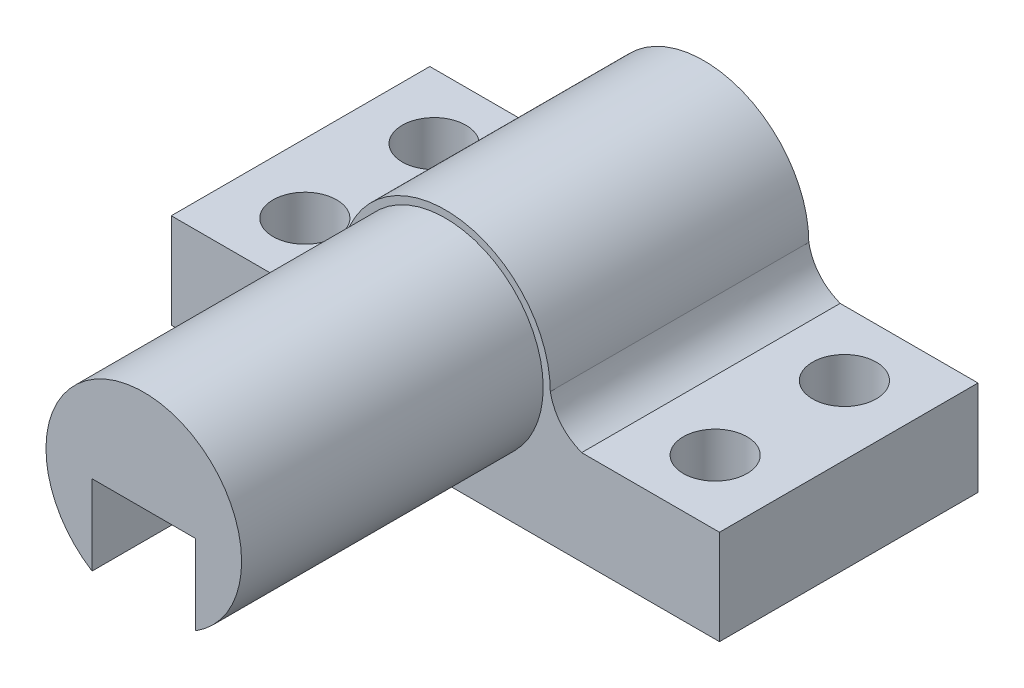
ISO-10303-21;
HEADER;
FILE_DESCRIPTION(('STEP AP214'),'2;1');
FILE_NAME('part.step','',(''),(''),'','','');
FILE_SCHEMA(('AUTOMOTIVE_DESIGN { 1 0 10303 214 1 1 1 1 }'));
ENDSEC;
DATA;
#1=APPLICATION_CONTEXT('core data for automotive mechanical design processes');
#2=APPLICATION_PROTOCOL_DEFINITION('international standard','automotive_design',2000,#1);
#3=PRODUCT_CONTEXT('',#1,'mechanical');
#4=PRODUCT('Part','Part','',(#3));
#5=PRODUCT_RELATED_PRODUCT_CATEGORY('part','',(#4));
#6=PRODUCT_DEFINITION_FORMATION('','',#4);
#7=PRODUCT_DEFINITION_CONTEXT('part definition',#1,'design');
#8=PRODUCT_DEFINITION('design','',#6,#7);
#9=PRODUCT_DEFINITION_SHAPE('','',#8);
#10=(LENGTH_UNIT() NAMED_UNIT(*) SI_UNIT(.MILLI.,.METRE.));
#11=(NAMED_UNIT(*) PLANE_ANGLE_UNIT() SI_UNIT($,.RADIAN.));
#12=(NAMED_UNIT(*) SI_UNIT($,.STERADIAN.) SOLID_ANGLE_UNIT());
#13=UNCERTAINTY_MEASURE_WITH_UNIT(LENGTH_MEASURE(1.E-05),#10,'distance_accuracy_value','');
#14=(GEOMETRIC_REPRESENTATION_CONTEXT(3) GLOBAL_UNCERTAINTY_ASSIGNED_CONTEXT((#13)) GLOBAL_UNIT_ASSIGNED_CONTEXT((#10,
#11,#12)) REPRESENTATION_CONTEXT('',''));
#15=CARTESIAN_POINT('',(0.,0.,0.));
#16=DIRECTION('',(0.,0.,1.));
#17=DIRECTION('',(1.,0.,0.));
#18=AXIS2_PLACEMENT_3D('',#15,#16,#17);
#19=CARTESIAN_POINT('',(15.8085768830098,-4.3236532196309,30.));
#20=CARTESIAN_POINT('',(12.801032903541,-3.08392205228038,30.));
#21=CARTESIAN_POINT('',(12.175,0.,30.));
#22=B_SPLINE_CURVE_WITH_KNOTS('',2,(#19,#20,#21),.UNSPECIFIED.,.F.,.F.,(3,3),(0.,1.),.UNSPECIFIED.);
#23=DIRECTION('',(0.,0.,-1.));
#24=VECTOR('',#23,1.);
#25=SURFACE_OF_LINEAR_EXTRUSION('',#22,#24);
#26=CARTESIAN_POINT('',(15.8085768830098,-4.3236532196309,0.));
#27=CARTESIAN_POINT('',(12.801032903541,-3.08392205228038,0.));
#28=CARTESIAN_POINT('',(12.175,0.,0.));
#29=B_SPLINE_CURVE_WITH_KNOTS('',2,(#26,#27,#28),.UNSPECIFIED.,.F.,.F.,(3,3),(0.,1.),.UNSPECIFIED.);
#30=CARTESIAN_POINT('',(15.8085768830097,-4.3236532196309,0.));
#31=VERTEX_POINT('',#30);
#32=CARTESIAN_POINT('',(12.175,0.,0.));
#33=VERTEX_POINT('',#32);
#34=EDGE_CURVE('E159',#31,#33,#29,.T.);
#35=ORIENTED_EDGE('',*,*,#34,.T.);
#36=DIRECTION('',(0.,0.,-1.));
#37=VECTOR('',#36,1.);
#38=CARTESIAN_POINT('',(12.175,0.,30.));
#39=LINE('',#38,#37);
#40=CARTESIAN_POINT('',(12.175,0.,30.));
#41=VERTEX_POINT('',#40);
#42=EDGE_CURVE('E212',#41,#33,#39,.T.);
#43=ORIENTED_EDGE('',*,*,#42,.F.);
#44=CARTESIAN_POINT('',(15.8085768830097,-4.3236532196309,30.));
#45=VERTEX_POINT('',#44);
#46=EDGE_CURVE('E193',#45,#41,#22,.T.);
#47=ORIENTED_EDGE('',*,*,#46,.F.);
#48=DIRECTION('',(0.,0.,-1.));
#49=VECTOR('',#48,1.);
#50=CARTESIAN_POINT('',(15.8085768830097,-4.3236532196309,30.));
#51=LINE('',#50,#49);
#52=EDGE_CURVE('E155',#45,#31,#51,.T.);
#53=ORIENTED_EDGE('',*,*,#52,.T.);
#54=EDGE_LOOP('',(#35,#43,#47,#53));
#55=FACE_BOUND('',#54,.T.);
#56=ADVANCED_FACE('F45',(#55),#25,.F.);
#57=CARTESIAN_POINT('',(0.,0.,30.));
#58=DIRECTION('',(0.,0.,-1.));
#59=DIRECTION('',(-1.,0.,0.));
#60=AXIS2_PLACEMENT_3D('',#57,#58,#59);
#61=CYLINDRICAL_SURFACE('',#60,12.175);
#62=CARTESIAN_POINT('',(0.,0.,0.));
#63=DIRECTION('',(0.,0.,1.));
#64=DIRECTION('',(1.,0.,0.));
#65=AXIS2_PLACEMENT_3D('',#62,#63,#64);
#66=CIRCLE('',#65,12.175);
#67=CARTESIAN_POINT('',(-12.175,0.,0.));
#68=VERTEX_POINT('',#67);
#69=EDGE_CURVE('E165',#33,#68,#66,.T.);
#70=ORIENTED_EDGE('',*,*,#69,.T.);
#71=DIRECTION('',(0.,0.,-1.));
#72=VECTOR('',#71,1.);
#73=CARTESIAN_POINT('',(-12.175,0.,30.));
#74=LINE('',#73,#72);
#75=CARTESIAN_POINT('',(-12.175,0.,30.));
#76=VERTEX_POINT('',#75);
#77=EDGE_CURVE('E208',#76,#68,#74,.T.);
#78=ORIENTED_EDGE('',*,*,#77,.F.);
#79=CARTESIAN_POINT('',(0.,0.,30.));
#80=DIRECTION('',(0.,0.,1.));
#81=DIRECTION('',(1.,0.,0.));
#82=AXIS2_PLACEMENT_3D('',#79,#80,#81);
#83=CIRCLE('',#82,12.175);
#84=EDGE_CURVE('E112',#41,#76,#83,.T.);
#85=ORIENTED_EDGE('',*,*,#84,.F.);
#86=ORIENTED_EDGE('',*,*,#42,.T.);
#87=EDGE_LOOP('',(#70,#78,#85,#86));
#88=FACE_BOUND('',#87,.T.);
#89=ADVANCED_FACE('F251',(#88),#61,.T.);
#90=CARTESIAN_POINT('',(-12.175,0.,30.));
#91=CARTESIAN_POINT('',(-12.801032903541,-3.08392205228038,30.));
#92=CARTESIAN_POINT('',(-15.8085768830097,-4.3236532196309,30.));
#93=B_SPLINE_CURVE_WITH_KNOTS('',2,(#90,#91,#92),.UNSPECIFIED.,.F.,.F.,(3,3),(0.,1.),.UNSPECIFIED.);
#94=DIRECTION('',(0.,0.,-1.));
#95=VECTOR('',#94,1.);
#96=SURFACE_OF_LINEAR_EXTRUSION('',#93,#95);
#97=CARTESIAN_POINT('',(-12.175,0.,0.));
#98=CARTESIAN_POINT('',(-12.801032903541,-3.08392205228038,0.));
#99=CARTESIAN_POINT('',(-15.8085768830097,-4.3236532196309,0.));
#100=B_SPLINE_CURVE_WITH_KNOTS('',2,(#97,#98,#99),.UNSPECIFIED.,.F.,.F.,(3,3),(0.,1.),.UNSPECIFIED.);
#101=CARTESIAN_POINT('',(-15.8085768830097,-4.3236532196309,0.));
#102=VERTEX_POINT('',#101);
#103=EDGE_CURVE('E172',#68,#102,#100,.T.);
#104=ORIENTED_EDGE('',*,*,#103,.T.);
#105=DIRECTION('',(0.,0.,-1.));
#106=VECTOR('',#105,1.);
#107=CARTESIAN_POINT('',(-15.8085768830097,-4.3236532196309,30.));
#108=LINE('',#107,#106);
#109=CARTESIAN_POINT('',(-15.8085768830097,-4.3236532196309,30.));
#110=VERTEX_POINT('',#109);
#111=EDGE_CURVE('E204',#110,#102,#108,.T.);
#112=ORIENTED_EDGE('',*,*,#111,.F.);
#113=EDGE_CURVE('E236',#76,#110,#93,.T.);
#114=ORIENTED_EDGE('',*,*,#113,.F.);
#115=ORIENTED_EDGE('',*,*,#77,.T.);
#116=EDGE_LOOP('',(#104,#112,#114,#115));
#117=FACE_BOUND('',#116,.T.);
#118=ADVANCED_FACE('F247',(#117),#96,.F.);
#119=CARTESIAN_POINT('',(-31.8085768830098,-4.32365321963091,30.));
#120=DIRECTION('',(0.,-1.,0.));
#121=DIRECTION('',(1.,0.,0.));
#122=AXIS2_PLACEMENT_3D('',#119,#120,#121);
#123=PLANE('',#122);
#124=CARTESIAN_POINT('',(-23.8085768830097,-4.3236532196309,22.5));
#125=DIRECTION('',(0.,1.,0.));
#126=DIRECTION('',(0.,0.,-1.));
#127=AXIS2_PLACEMENT_3D('',#124,#125,#126);
#128=CIRCLE('',#127,3.7);
#129=CARTESIAN_POINT('',(-23.8085768830097,-4.3236532196309,18.8));
#130=VERTEX_POINT('',#129);
#131=EDGE_CURVE('E304',#130,#130,#128,.T.);
#132=ORIENTED_EDGE('',*,*,#131,.F.);
#133=EDGE_LOOP('',(#132));
#134=FACE_BOUND('',#133,.T.);
#135=CARTESIAN_POINT('',(-23.8085768830097,-4.3236532196309,7.5));
#136=DIRECTION('',(0.,1.,0.));
#137=DIRECTION('',(0.,0.,1.));
#138=AXIS2_PLACEMENT_3D('',#135,#136,#137);
#139=CIRCLE('',#138,3.7);
#140=CARTESIAN_POINT('',(-23.8085768830097,-4.3236532196309,11.2));
#141=VERTEX_POINT('',#140);
#142=EDGE_CURVE('E307',#141,#141,#139,.T.);
#143=ORIENTED_EDGE('',*,*,#142,.F.);
#144=EDGE_LOOP('',(#143));
#145=FACE_BOUND('',#144,.T.);
#146=DIRECTION('',(-1.,0.,0.));
#147=VECTOR('',#146,1.);
#148=CARTESIAN_POINT('',(-31.8085768830098,-4.32365321963091,0.));
#149=LINE('',#148,#147);
#150=CARTESIAN_POINT('',(-31.8085768830098,-4.32365321963091,0.));
#151=VERTEX_POINT('',#150);
#152=EDGE_CURVE('E177',#102,#151,#149,.T.);
#153=ORIENTED_EDGE('',*,*,#152,.T.);
#154=DIRECTION('',(0.,0.,-1.));
#155=VECTOR('',#154,1.);
#156=CARTESIAN_POINT('',(-31.8085768830098,-4.32365321963091,30.));
#157=LINE('',#156,#155);
#158=CARTESIAN_POINT('',(-31.8085768830098,-4.32365321963091,30.));
#159=VERTEX_POINT('',#158);
#160=EDGE_CURVE('E200',#159,#151,#157,.T.);
#161=ORIENTED_EDGE('',*,*,#160,.F.);
#162=DIRECTION('',(-1.,0.,0.));
#163=VECTOR('',#162,1.);
#164=CARTESIAN_POINT('',(-31.8085768830098,-4.32365321963091,30.));
#165=LINE('',#164,#163);
#166=EDGE_CURVE('E242',#110,#159,#165,.T.);
#167=ORIENTED_EDGE('',*,*,#166,.F.);
#168=ORIENTED_EDGE('',*,*,#111,.T.);
#169=EDGE_LOOP('',(#153,#161,#167,#168));
#170=FACE_BOUND('',#169,.T.);
#171=ADVANCED_FACE('F250',(#134,#145,#170),#123,.F.);
#172=CARTESIAN_POINT('',(-31.8085768830098,-15.3236532196309,30.));
#173=DIRECTION('',(1.,0.,0.));
#174=DIRECTION('',(0.,0.,-1.));
#175=AXIS2_PLACEMENT_3D('',#172,#173,#174);
#176=PLANE('',#175);
#177=DIRECTION('',(0.,-1.,0.));
#178=VECTOR('',#177,1.);
#179=CARTESIAN_POINT('',(-31.8085768830098,-15.3236532196309,0.));
#180=LINE('',#179,#178);
#181=CARTESIAN_POINT('',(-31.8085768830098,-15.3236532196309,0.));
#182=VERTEX_POINT('',#181);
#183=EDGE_CURVE('E183',#151,#182,#180,.T.);
#184=ORIENTED_EDGE('',*,*,#183,.T.);
#185=DIRECTION('',(0.,0.,-1.));
#186=VECTOR('',#185,1.);
#187=CARTESIAN_POINT('',(-31.8085768830098,-15.3236532196309,30.));
#188=LINE('',#187,#186);
#189=CARTESIAN_POINT('',(-31.8085768830098,-15.3236532196309,30.));
#190=VERTEX_POINT('',#189);
#191=EDGE_CURVE('E148',#190,#182,#188,.T.);
#192=ORIENTED_EDGE('',*,*,#191,.F.);
#193=DIRECTION('',(0.,-1.,0.));
#194=VECTOR('',#193,1.);
#195=CARTESIAN_POINT('',(-31.8085768830098,-15.3236532196309,30.));
#196=LINE('',#195,#194);
#197=EDGE_CURVE('E134',#159,#190,#196,.T.);
#198=ORIENTED_EDGE('',*,*,#197,.F.);
#199=ORIENTED_EDGE('',*,*,#160,.T.);
#200=EDGE_LOOP('',(#184,#192,#198,#199));
#201=FACE_BOUND('',#200,.T.);
#202=ADVANCED_FACE('F272',(#201),#176,.F.);
#203=CARTESIAN_POINT('',(-31.8085768830098,-15.3236532196309,30.));
#204=DIRECTION('',(0.,1.,0.));
#205=DIRECTION('',(-1.,0.,0.));
#206=AXIS2_PLACEMENT_3D('',#203,#204,#205);
#207=PLANE('',#206);
#208=CARTESIAN_POINT('',(23.8085768830097,-15.3236532196309,7.5));
#209=DIRECTION('',(0.,1.,0.));
#210=DIRECTION('',(0.,0.,-1.));
#211=AXIS2_PLACEMENT_3D('',#208,#209,#210);
#212=CIRCLE('',#211,3.7);
#213=CARTESIAN_POINT('',(23.8085768830097,-15.3236532196309,3.8));
#214=VERTEX_POINT('',#213);
#215=EDGE_CURVE('E318',#214,#214,#212,.T.);
#216=ORIENTED_EDGE('',*,*,#215,.T.);
#217=EDGE_LOOP('',(#216));
#218=FACE_BOUND('',#217,.T.);
#219=CARTESIAN_POINT('',(23.8085768830097,-15.3236532196309,22.5));
#220=DIRECTION('',(0.,1.,0.));
#221=DIRECTION('',(0.,0.,1.));
#222=AXIS2_PLACEMENT_3D('',#219,#220,#221);
#223=CIRCLE('',#222,3.7);
#224=CARTESIAN_POINT('',(23.8085768830097,-15.3236532196309,26.2));
#225=VERTEX_POINT('',#224);
#226=EDGE_CURVE('E327',#225,#225,#223,.T.);
#227=ORIENTED_EDGE('',*,*,#226,.T.);
#228=EDGE_LOOP('',(#227));
#229=FACE_BOUND('',#228,.T.);
#230=CARTESIAN_POINT('',(-23.8085768830097,-15.3236532196309,22.5));
#231=DIRECTION('',(0.,1.,0.));
#232=DIRECTION('',(0.,0.,-1.));
#233=AXIS2_PLACEMENT_3D('',#230,#231,#232);
#234=CIRCLE('',#233,3.7);
#235=CARTESIAN_POINT('',(-23.8085768830097,-15.3236532196309,18.8));
#236=VERTEX_POINT('',#235);
#237=EDGE_CURVE('E315',#236,#236,#234,.T.);
#238=ORIENTED_EDGE('',*,*,#237,.T.);
#239=EDGE_LOOP('',(#238));
#240=FACE_BOUND('',#239,.T.);
#241=CARTESIAN_POINT('',(-23.8085768830097,-15.3236532196309,7.5));
#242=DIRECTION('',(0.,1.,0.));
#243=DIRECTION('',(0.,0.,1.));
#244=AXIS2_PLACEMENT_3D('',#241,#242,#243);
#245=CIRCLE('',#244,3.7);
#246=CARTESIAN_POINT('',(-23.8085768830097,-15.3236532196309,11.2));
#247=VERTEX_POINT('',#246);
#248=EDGE_CURVE('E310',#247,#247,#245,.T.);
#249=ORIENTED_EDGE('',*,*,#248,.T.);
#250=EDGE_LOOP('',(#249));
#251=FACE_BOUND('',#250,.T.);
#252=DIRECTION('',(1.,0.,0.));
#253=VECTOR('',#252,1.);
#254=CARTESIAN_POINT('',(-31.8085768830098,-15.3236532196309,0.));
#255=LINE('',#254,#253);
#256=CARTESIAN_POINT('',(31.8085768830098,-15.3236532196309,0.));
#257=VERTEX_POINT('',#256);
#258=EDGE_CURVE('E144',#182,#257,#255,.T.);
#259=ORIENTED_EDGE('',*,*,#258,.T.);
#260=DIRECTION('',(0.,0.,-1.));
#261=VECTOR('',#260,1.);
#262=CARTESIAN_POINT('',(31.8085768830098,-15.3236532196309,30.));
#263=LINE('',#262,#261);
#264=CARTESIAN_POINT('',(31.8085768830098,-15.3236532196309,30.));
#265=VERTEX_POINT('',#264);
#266=EDGE_CURVE('E141',#265,#257,#263,.T.);
#267=ORIENTED_EDGE('',*,*,#266,.F.);
#268=DIRECTION('',(1.,0.,0.));
#269=VECTOR('',#268,1.);
#270=CARTESIAN_POINT('',(-31.8085768830098,-15.3236532196309,30.));
#271=LINE('',#270,#269);
#272=EDGE_CURVE('E127',#190,#265,#271,.T.);
#273=ORIENTED_EDGE('',*,*,#272,.F.);
#274=ORIENTED_EDGE('',*,*,#191,.T.);
#275=EDGE_LOOP('',(#259,#267,#273,#274));
#276=FACE_BOUND('',#275,.T.);
#277=ADVANCED_FACE('F142',(#218,#229,#240,#251,#276),#207,.F.);
#278=CARTESIAN_POINT('',(31.8085768830098,-15.3236532196309,30.));
#279=DIRECTION('',(-1.,0.,0.));
#280=DIRECTION('',(0.,0.,1.));
#281=AXIS2_PLACEMENT_3D('',#278,#279,#280);
#282=PLANE('',#281);
#283=DIRECTION('',(0.,1.,0.));
#284=VECTOR('',#283,1.);
#285=CARTESIAN_POINT('',(31.8085768830098,-15.3236532196309,0.));
#286=LINE('',#285,#284);
#287=CARTESIAN_POINT('',(31.8085768830098,-4.3236532196309,0.));
#288=VERTEX_POINT('',#287);
#289=EDGE_CURVE('E188',#257,#288,#286,.T.);
#290=ORIENTED_EDGE('',*,*,#289,.T.);
#291=DIRECTION('',(0.,0.,-1.));
#292=VECTOR('',#291,1.);
#293=CARTESIAN_POINT('',(31.8085768830098,-4.3236532196309,30.));
#294=LINE('',#293,#292);
#295=CARTESIAN_POINT('',(31.8085768830098,-4.3236532196309,30.));
#296=VERTEX_POINT('',#295);
#297=EDGE_CURVE('E149',#296,#288,#294,.T.);
#298=ORIENTED_EDGE('',*,*,#297,.F.);
#299=DIRECTION('',(0.,1.,0.));
#300=VECTOR('',#299,1.);
#301=CARTESIAN_POINT('',(31.8085768830098,-15.3236532196309,30.));
#302=LINE('',#301,#300);
#303=EDGE_CURVE('E131',#265,#296,#302,.T.);
#304=ORIENTED_EDGE('',*,*,#303,.F.);
#305=ORIENTED_EDGE('',*,*,#266,.T.);
#306=EDGE_LOOP('',(#290,#298,#304,#305));
#307=FACE_BOUND('',#306,.T.);
#308=ADVANCED_FACE('F151',(#307),#282,.F.);
#309=CARTESIAN_POINT('',(31.8085768830098,-4.3236532196309,30.));
#310=DIRECTION('',(0.,-1.,0.));
#311=DIRECTION('',(1.,0.,0.));
#312=AXIS2_PLACEMENT_3D('',#309,#310,#311);
#313=PLANE('',#312);
#314=CARTESIAN_POINT('',(23.8085768830097,-4.3236532196309,7.5));
#315=DIRECTION('',(0.,1.,0.));
#316=DIRECTION('',(0.,0.,-1.));
#317=AXIS2_PLACEMENT_3D('',#314,#315,#316);
#318=CIRCLE('',#317,3.7);
#319=CARTESIAN_POINT('',(23.8085768830097,-4.3236532196309,3.8));
#320=VERTEX_POINT('',#319);
#321=EDGE_CURVE('E322',#320,#320,#318,.T.);
#322=ORIENTED_EDGE('',*,*,#321,.F.);
#323=EDGE_LOOP('',(#322));
#324=FACE_BOUND('',#323,.T.);
#325=CARTESIAN_POINT('',(23.8085768830097,-4.3236532196309,22.5));
#326=DIRECTION('',(0.,1.,0.));
#327=DIRECTION('',(0.,0.,1.));
#328=AXIS2_PLACEMENT_3D('',#325,#326,#327);
#329=CIRCLE('',#328,3.7);
#330=CARTESIAN_POINT('',(23.8085768830097,-4.3236532196309,26.2));
#331=VERTEX_POINT('',#330);
#332=EDGE_CURVE('E331',#331,#331,#329,.T.);
#333=ORIENTED_EDGE('',*,*,#332,.F.);
#334=EDGE_LOOP('',(#333));
#335=FACE_BOUND('',#334,.T.);
#336=DIRECTION('',(-1.,0.,0.));
#337=VECTOR('',#336,1.);
#338=CARTESIAN_POINT('',(31.8085768830098,-4.3236532196309,0.));
#339=LINE('',#338,#337);
#340=EDGE_CURVE('E103',#288,#31,#339,.T.);
#341=ORIENTED_EDGE('',*,*,#340,.T.);
#342=ORIENTED_EDGE('',*,*,#52,.F.);
#343=DIRECTION('',(-1.,0.,0.));
#344=VECTOR('',#343,1.);
#345=CARTESIAN_POINT('',(31.8085768830098,-4.3236532196309,30.));
#346=LINE('',#345,#344);
#347=EDGE_CURVE('E70',#296,#45,#346,.T.);
#348=ORIENTED_EDGE('',*,*,#347,.F.);
#349=ORIENTED_EDGE('',*,*,#297,.T.);
#350=EDGE_LOOP('',(#341,#342,#348,#349));
#351=FACE_BOUND('',#350,.T.);
#352=ADVANCED_FACE('F276',(#324,#335,#351),#313,.F.);
#353=CARTESIAN_POINT('',(13.3964106725229,-2.62287433104791,30.));
#354=DIRECTION('',(0.,0.,-1.));
#355=DIRECTION('',(-1.,0.,0.));
#356=AXIS2_PLACEMENT_3D('',#353,#354,#355);
#357=PLANE('',#356);
#358=CARTESIAN_POINT('',(0.,0.,30.));
#359=DIRECTION('',(0.,0.,1.));
#360=DIRECTION('',(1.,0.,0.));
#361=AXIS2_PLACEMENT_3D('',#358,#359,#360);
#362=CIRCLE('',#361,11.35);
#363=CARTESIAN_POINT('',(11.35,0.,30.));
#364=VERTEX_POINT('',#363);
#365=EDGE_CURVE('E214',#364,#364,#362,.T.);
#366=ORIENTED_EDGE('',*,*,#365,.F.);
#367=EDGE_LOOP('',(#366));
#368=FACE_BOUND('',#367,.T.);
#369=ORIENTED_EDGE('',*,*,#46,.T.);
#370=ORIENTED_EDGE('',*,*,#84,.T.);
#371=ORIENTED_EDGE('',*,*,#113,.T.);
#372=ORIENTED_EDGE('',*,*,#166,.T.);
#373=ORIENTED_EDGE('',*,*,#197,.T.);
#374=ORIENTED_EDGE('',*,*,#272,.T.);
#375=ORIENTED_EDGE('',*,*,#303,.T.);
#376=ORIENTED_EDGE('',*,*,#347,.T.);
#377=EDGE_LOOP('',(#369,#370,#371,#372,#373,#374,#375,#376));
#378=FACE_BOUND('',#377,.T.);
#379=ADVANCED_FACE('F129',(#368,#378),#357,.F.);
#380=CARTESIAN_POINT('',(13.3964106725229,-2.62287433104791,0.));
#381=DIRECTION('',(0.,0.,-1.));
#382=DIRECTION('',(-1.,0.,0.));
#383=AXIS2_PLACEMENT_3D('',#380,#381,#382);
#384=PLANE('',#383);
#385=ORIENTED_EDGE('',*,*,#34,.F.);
#386=ORIENTED_EDGE('',*,*,#340,.F.);
#387=ORIENTED_EDGE('',*,*,#289,.F.);
#388=ORIENTED_EDGE('',*,*,#258,.F.);
#389=ORIENTED_EDGE('',*,*,#183,.F.);
#390=ORIENTED_EDGE('',*,*,#152,.F.);
#391=ORIENTED_EDGE('',*,*,#103,.F.);
#392=ORIENTED_EDGE('',*,*,#69,.F.);
#393=EDGE_LOOP('',(#385,#386,#387,#388,#389,#390,#391,#392));
#394=FACE_BOUND('',#393,.T.);
#395=ADVANCED_FACE('F266',(#394),#384,.T.);
#396=CARTESIAN_POINT('',(0.,0.,65.));
#397=DIRECTION('',(0.,0.,-1.));
#398=DIRECTION('',(-1.,0.,0.));
#399=AXIS2_PLACEMENT_3D('',#396,#397,#398);
#400=CYLINDRICAL_SURFACE('',#399,11.35);
#401=CARTESIAN_POINT('',(0.,0.,37.));
#402=DIRECTION('',(0.,0.,1.));
#403=DIRECTION('',(1.,0.,0.));
#404=AXIS2_PLACEMENT_3D('',#401,#402,#403);
#405=CIRCLE('',#404,11.35);
#406=CARTESIAN_POINT('',(-6.,-9.63444341931593,37.));
#407=VERTEX_POINT('',#406);
#408=CARTESIAN_POINT('',(6.,-9.63444341931593,37.));
#409=VERTEX_POINT('',#408);
#410=EDGE_CURVE('E11',#407,#409,#405,.T.);
#411=ORIENTED_EDGE('',*,*,#410,.F.);
#412=DIRECTION('',(0.,0.,-1.));
#413=VECTOR('',#412,1.);
#414=CARTESIAN_POINT('',(-6.,-9.63444341931593,65.));
#415=LINE('',#414,#413);
#416=CARTESIAN_POINT('',(-6.,-9.63444341931593,65.));
#417=VERTEX_POINT('',#416);
#418=EDGE_CURVE('E323',#407,#417,#415,.F.);
#419=ORIENTED_EDGE('',*,*,#418,.T.);
#420=CARTESIAN_POINT('',(0.,0.,65.));
#421=DIRECTION('',(0.,0.,1.));
#422=DIRECTION('',(1.,0.,0.));
#423=AXIS2_PLACEMENT_3D('',#420,#421,#422);
#424=CIRCLE('',#423,11.35);
#425=CARTESIAN_POINT('',(6.,-9.63444341931593,65.));
#426=VERTEX_POINT('',#425);
#427=EDGE_CURVE('E166',#426,#417,#424,.T.);
#428=ORIENTED_EDGE('',*,*,#427,.F.);
#429=DIRECTION('',(0.,0.,-1.));
#430=VECTOR('',#429,1.);
#431=CARTESIAN_POINT('',(6.,-9.63444341931593,65.));
#432=LINE('',#431,#430);
#433=EDGE_CURVE('E61',#426,#409,#432,.T.);
#434=ORIENTED_EDGE('',*,*,#433,.T.);
#435=EDGE_LOOP('',(#411,#419,#428,#434));
#436=FACE_BOUND('',#435,.T.);
#437=ORIENTED_EDGE('',*,*,#365,.T.);
#438=EDGE_LOOP('',(#437));
#439=FACE_BOUND('',#438,.T.);
#440=ADVANCED_FACE('F397',(#436,#439),#400,.T.);
#441=CARTESIAN_POINT('',(0.,0.,65.));
#442=DIRECTION('',(0.,0.,1.));
#443=DIRECTION('',(1.,0.,0.));
#444=AXIS2_PLACEMENT_3D('',#441,#442,#443);
#445=PLANE('',#444);
#446=DIRECTION('',(0.,-1.,0.));
#447=VECTOR('',#446,1.);
#448=CARTESIAN_POINT('',(-6.,-0.350000000000003,65.));
#449=LINE('',#448,#447);
#450=CARTESIAN_POINT('',(-6.,-0.350000000000003,65.));
#451=VERTEX_POINT('',#450);
#452=EDGE_CURVE('E351',#451,#417,#449,.T.);
#453=ORIENTED_EDGE('',*,*,#452,.F.);
#454=DIRECTION('',(-1.,0.,0.));
#455=VECTOR('',#454,1.);
#456=CARTESIAN_POINT('',(-6.,-0.350000000000003,65.));
#457=LINE('',#456,#455);
#458=CARTESIAN_POINT('',(6.,-0.350000000000003,65.));
#459=VERTEX_POINT('',#458);
#460=EDGE_CURVE('E356',#459,#451,#457,.T.);
#461=ORIENTED_EDGE('',*,*,#460,.F.);
#462=DIRECTION('',(0.,1.,0.));
#463=VECTOR('',#462,1.);
#464=CARTESIAN_POINT('',(6.,0.,65.));
#465=LINE('',#464,#463);
#466=EDGE_CURVE('E54',#426,#459,#465,.T.);
#467=ORIENTED_EDGE('',*,*,#466,.F.);
#468=ORIENTED_EDGE('',*,*,#427,.T.);
#469=EDGE_LOOP('',(#453,#461,#467,#468));
#470=FACE_BOUND('',#469,.T.);
#471=ADVANCED_FACE('F398',(#470),#445,.T.);
#472=CARTESIAN_POINT('',(23.8085768830097,-15.3236532196309,22.5));
#473=DIRECTION('',(0.,1.,0.));
#474=DIRECTION('',(0.,0.,1.));
#475=AXIS2_PLACEMENT_3D('',#472,#473,#474);
#476=CYLINDRICAL_SURFACE('',#475,3.7);
#477=ORIENTED_EDGE('',*,*,#226,.F.);
#478=EDGE_LOOP('',(#477));
#479=FACE_BOUND('',#478,.T.);
#480=ORIENTED_EDGE('',*,*,#332,.T.);
#481=EDGE_LOOP('',(#480));
#482=FACE_BOUND('',#481,.T.);
#483=ADVANCED_FACE('F401',(#479,#482),#476,.F.);
#484=CARTESIAN_POINT('',(23.8085768830097,-15.3236532196309,7.5));
#485=DIRECTION('',(0.,1.,0.));
#486=DIRECTION('',(0.,0.,1.));
#487=AXIS2_PLACEMENT_3D('',#484,#485,#486);
#488=CYLINDRICAL_SURFACE('',#487,3.7);
#489=ORIENTED_EDGE('',*,*,#215,.F.);
#490=EDGE_LOOP('',(#489));
#491=FACE_BOUND('',#490,.T.);
#492=ORIENTED_EDGE('',*,*,#321,.T.);
#493=EDGE_LOOP('',(#492));
#494=FACE_BOUND('',#493,.T.);
#495=ADVANCED_FACE('F407',(#491,#494),#488,.F.);
#496=CARTESIAN_POINT('',(-23.8085768830097,-15.3236532196309,7.5));
#497=DIRECTION('',(0.,1.,0.));
#498=DIRECTION('',(0.,0.,1.));
#499=AXIS2_PLACEMENT_3D('',#496,#497,#498);
#500=CYLINDRICAL_SURFACE('',#499,3.7);
#501=ORIENTED_EDGE('',*,*,#248,.F.);
#502=EDGE_LOOP('',(#501));
#503=FACE_BOUND('',#502,.T.);
#504=ORIENTED_EDGE('',*,*,#142,.T.);
#505=EDGE_LOOP('',(#504));
#506=FACE_BOUND('',#505,.T.);
#507=ADVANCED_FACE('F412',(#503,#506),#500,.F.);
#508=CARTESIAN_POINT('',(-23.8085768830097,-15.3236532196309,22.5));
#509=DIRECTION('',(0.,1.,0.));
#510=DIRECTION('',(0.,0.,1.));
#511=AXIS2_PLACEMENT_3D('',#508,#509,#510);
#512=CYLINDRICAL_SURFACE('',#511,3.7);
#513=ORIENTED_EDGE('',*,*,#237,.F.);
#514=EDGE_LOOP('',(#513));
#515=FACE_BOUND('',#514,.T.);
#516=ORIENTED_EDGE('',*,*,#131,.T.);
#517=EDGE_LOOP('',(#516));
#518=FACE_BOUND('',#517,.T.);
#519=ADVANCED_FACE('F415',(#515,#518),#512,.F.);
#520=CARTESIAN_POINT('',(0.,0.,37.));
#521=DIRECTION('',(0.,0.,1.));
#522=DIRECTION('',(1.,0.,0.));
#523=AXIS2_PLACEMENT_3D('',#520,#521,#522);
#524=PLANE('',#523);
#525=DIRECTION('',(0.,-1.,0.));
#526=VECTOR('',#525,1.);
#527=CARTESIAN_POINT('',(-6.,-0.350000000000003,37.));
#528=LINE('',#527,#526);
#529=CARTESIAN_POINT('',(-6.,-0.350000000000003,37.));
#530=VERTEX_POINT('',#529);
#531=EDGE_CURVE('E347',#530,#407,#528,.T.);
#532=ORIENTED_EDGE('',*,*,#531,.T.);
#533=ORIENTED_EDGE('',*,*,#410,.T.);
#534=DIRECTION('',(0.,1.,0.));
#535=VECTOR('',#534,1.);
#536=CARTESIAN_POINT('',(6.,-0.350000000000003,37.));
#537=LINE('',#536,#535);
#538=CARTESIAN_POINT('',(6.,-0.350000000000003,37.));
#539=VERTEX_POINT('',#538);
#540=EDGE_CURVE('E355',#409,#539,#537,.T.);
#541=ORIENTED_EDGE('',*,*,#540,.T.);
#542=DIRECTION('',(-1.,0.,0.));
#543=VECTOR('',#542,1.);
#544=CARTESIAN_POINT('',(-6.,-0.350000000000003,37.));
#545=LINE('',#544,#543);
#546=EDGE_CURVE('E363',#539,#530,#545,.T.);
#547=ORIENTED_EDGE('',*,*,#546,.T.);
#548=EDGE_LOOP('',(#532,#533,#541,#547));
#549=FACE_BOUND('',#548,.T.);
#550=ADVANCED_FACE('F371',(#549),#524,.T.);
#551=CARTESIAN_POINT('',(-6.,-0.350000000000003,37.));
#552=DIRECTION('',(-1.,0.,0.));
#553=DIRECTION('',(0.,0.,1.));
#554=AXIS2_PLACEMENT_3D('',#551,#552,#553);
#555=PLANE('',#554);
#556=ORIENTED_EDGE('',*,*,#531,.F.);
#557=DIRECTION('',(0.,0.,1.));
#558=VECTOR('',#557,1.);
#559=CARTESIAN_POINT('',(-6.,-0.350000000000003,37.));
#560=LINE('',#559,#558);
#561=EDGE_CURVE('E343',#530,#451,#560,.T.);
#562=ORIENTED_EDGE('',*,*,#561,.T.);
#563=ORIENTED_EDGE('',*,*,#452,.T.);
#564=ORIENTED_EDGE('',*,*,#418,.F.);
#565=EDGE_LOOP('',(#556,#562,#563,#564));
#566=FACE_BOUND('',#565,.T.);
#567=ADVANCED_FACE('F388',(#566),#555,.F.);
#568=CARTESIAN_POINT('',(6.,-0.350000000000003,37.));
#569=DIRECTION('',(1.,0.,0.));
#570=DIRECTION('',(0.,0.,-1.));
#571=AXIS2_PLACEMENT_3D('',#568,#569,#570);
#572=PLANE('',#571);
#573=ORIENTED_EDGE('',*,*,#466,.T.);
#574=DIRECTION('',(0.,0.,1.));
#575=VECTOR('',#574,1.);
#576=CARTESIAN_POINT('',(6.,-0.350000000000003,37.));
#577=LINE('',#576,#575);
#578=EDGE_CURVE('E344',#539,#459,#577,.T.);
#579=ORIENTED_EDGE('',*,*,#578,.F.);
#580=ORIENTED_EDGE('',*,*,#540,.F.);
#581=ORIENTED_EDGE('',*,*,#433,.F.);
#582=EDGE_LOOP('',(#573,#579,#580,#581));
#583=FACE_BOUND('',#582,.T.);
#584=ADVANCED_FACE('F378',(#583),#572,.F.);
#585=CARTESIAN_POINT('',(-6.,-0.350000000000003,37.));
#586=DIRECTION('',(0.,1.,0.));
#587=DIRECTION('',(0.,0.,1.));
#588=AXIS2_PLACEMENT_3D('',#585,#586,#587);
#589=PLANE('',#588);
#590=ORIENTED_EDGE('',*,*,#460,.T.);
#591=ORIENTED_EDGE('',*,*,#561,.F.);
#592=ORIENTED_EDGE('',*,*,#546,.F.);
#593=ORIENTED_EDGE('',*,*,#578,.T.);
#594=EDGE_LOOP('',(#590,#591,#592,#593));
#595=FACE_BOUND('',#594,.T.);
#596=ADVANCED_FACE('F382',(#595),#589,.F.);
#597=CLOSED_SHELL('',(#56,#89,#118,#171,#202,#277,#308,#352,#379,#395,#440,#471,#483,#495,#507,
#519,#550,#567,#584,#596));
#598=MANIFOLD_SOLID_BREP('B2',#597);
#599=ADVANCED_BREP_SHAPE_REPRESENTATION('',(#18,#598),#14);
#600=SHAPE_DEFINITION_REPRESENTATION(#9,#599);
ENDSEC;
END-ISO-10303-21;
